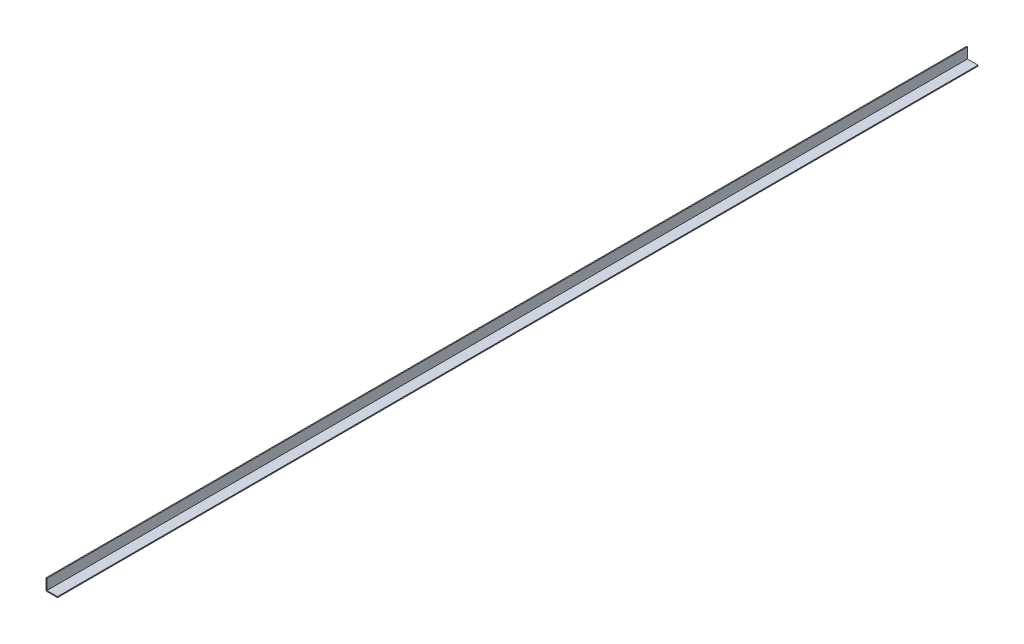
ISO-10303-21;
HEADER;
FILE_DESCRIPTION(('STEP AP214'),'2;1');
FILE_NAME('part.step','',(''),(''),'','','');
FILE_SCHEMA(('AUTOMOTIVE_DESIGN { 1 0 10303 214 1 1 1 1 }'));
ENDSEC;
DATA;
#1=APPLICATION_CONTEXT('core data for automotive mechanical design processes');
#2=APPLICATION_PROTOCOL_DEFINITION('international standard','automotive_design',2000,#1);
#3=PRODUCT_CONTEXT('',#1,'mechanical');
#4=PRODUCT('Part','Part','',(#3));
#5=PRODUCT_RELATED_PRODUCT_CATEGORY('part','',(#4));
#6=PRODUCT_DEFINITION_FORMATION('','',#4);
#7=PRODUCT_DEFINITION_CONTEXT('part definition',#1,'design');
#8=PRODUCT_DEFINITION('design','',#6,#7);
#9=PRODUCT_DEFINITION_SHAPE('','',#8);
#10=(LENGTH_UNIT() NAMED_UNIT(*) SI_UNIT(.MILLI.,.METRE.));
#11=(NAMED_UNIT(*) PLANE_ANGLE_UNIT() SI_UNIT($,.RADIAN.));
#12=(NAMED_UNIT(*) SI_UNIT($,.STERADIAN.) SOLID_ANGLE_UNIT());
#13=UNCERTAINTY_MEASURE_WITH_UNIT(LENGTH_MEASURE(1.E-05),#10,'distance_accuracy_value','');
#14=(GEOMETRIC_REPRESENTATION_CONTEXT(3) GLOBAL_UNCERTAINTY_ASSIGNED_CONTEXT((#13)) GLOBAL_UNIT_ASSIGNED_CONTEXT((#10,
#11,#12)) REPRESENTATION_CONTEXT('',''));
#15=CARTESIAN_POINT('',(0.,0.,0.));
#16=DIRECTION('',(0.,0.,1.));
#17=DIRECTION('',(1.,0.,0.));
#18=AXIS2_PLACEMENT_3D('',#15,#16,#17);
#19=CARTESIAN_POINT('',(6.35,76.2,-6100.));
#20=DIRECTION('',(0.,1.,0.));
#21=DIRECTION('',(0.,0.,1.));
#22=AXIS2_PLACEMENT_3D('',#19,#20,#21);
#23=PLANE('',#22);
#24=DIRECTION('',(-1.,0.,0.));
#25=VECTOR('',#24,1.);
#26=CARTESIAN_POINT('',(6.35,76.2,0.));
#27=LINE('',#26,#25);
#28=CARTESIAN_POINT('',(6.35,76.2,0.));
#29=VERTEX_POINT('',#28);
#30=CARTESIAN_POINT('',(0.,76.2,0.));
#31=VERTEX_POINT('',#30);
#32=EDGE_CURVE('E118',#29,#31,#27,.T.);
#33=ORIENTED_EDGE('',*,*,#32,.F.);
#34=DIRECTION('',(0.,0.,1.));
#35=VECTOR('',#34,1.);
#36=CARTESIAN_POINT('',(6.35,76.2,-6100.));
#37=LINE('',#36,#35);
#38=CARTESIAN_POINT('',(6.35,76.2,-6100.));
#39=VERTEX_POINT('',#38);
#40=EDGE_CURVE('E11',#39,#29,#37,.T.);
#41=ORIENTED_EDGE('',*,*,#40,.F.);
#42=DIRECTION('',(-1.,0.,0.));
#43=VECTOR('',#42,1.);
#44=CARTESIAN_POINT('',(6.35,76.2,-6100.));
#45=LINE('',#44,#43);
#46=CARTESIAN_POINT('',(0.,76.2,-6100.));
#47=VERTEX_POINT('',#46);
#48=EDGE_CURVE('E132',#39,#47,#45,.T.);
#49=ORIENTED_EDGE('',*,*,#48,.T.);
#50=DIRECTION('',(0.,0.,1.));
#51=VECTOR('',#50,1.);
#52=CARTESIAN_POINT('',(0.,76.2,-6100.));
#53=LINE('',#52,#51);
#54=EDGE_CURVE('E36',#47,#31,#53,.T.);
#55=ORIENTED_EDGE('',*,*,#54,.T.);
#56=EDGE_LOOP('',(#33,#41,#49,#55));
#57=FACE_BOUND('',#56,.T.);
#58=ADVANCED_FACE('F33',(#57),#23,.T.);
#59=CARTESIAN_POINT('',(6.35,6.35,-6100.));
#60=DIRECTION('',(1.,0.,0.));
#61=DIRECTION('',(0.,1.,0.));
#62=AXIS2_PLACEMENT_3D('',#59,#60,#61);
#63=PLANE('',#62);
#64=DIRECTION('',(0.,1.,0.));
#65=VECTOR('',#64,1.);
#66=CARTESIAN_POINT('',(6.35,6.35,0.));
#67=LINE('',#66,#65);
#68=CARTESIAN_POINT('',(6.35,6.35,0.));
#69=VERTEX_POINT('',#68);
#70=EDGE_CURVE('E130',#69,#29,#67,.T.);
#71=ORIENTED_EDGE('',*,*,#70,.F.);
#72=DIRECTION('',(0.,0.,1.));
#73=VECTOR('',#72,1.);
#74=CARTESIAN_POINT('',(6.35,6.35,-6100.));
#75=LINE('',#74,#73);
#76=CARTESIAN_POINT('',(6.35,6.35,-6100.));
#77=VERTEX_POINT('',#76);
#78=EDGE_CURVE('E42',#77,#69,#75,.T.);
#79=ORIENTED_EDGE('',*,*,#78,.F.);
#80=DIRECTION('',(0.,1.,0.));
#81=VECTOR('',#80,1.);
#82=CARTESIAN_POINT('',(6.35,6.35,-6100.));
#83=LINE('',#82,#81);
#84=EDGE_CURVE('E108',#77,#39,#83,.T.);
#85=ORIENTED_EDGE('',*,*,#84,.T.);
#86=ORIENTED_EDGE('',*,*,#40,.T.);
#87=EDGE_LOOP('',(#71,#79,#85,#86));
#88=FACE_BOUND('',#87,.T.);
#89=ADVANCED_FACE('F140',(#88),#63,.T.);
#90=CARTESIAN_POINT('',(76.2,6.35,-6100.));
#91=DIRECTION('',(0.,1.,0.));
#92=DIRECTION('',(-1.,0.,0.));
#93=AXIS2_PLACEMENT_3D('',#90,#91,#92);
#94=PLANE('',#93);
#95=DIRECTION('',(-1.,0.,0.));
#96=VECTOR('',#95,1.);
#97=CARTESIAN_POINT('',(76.2,6.35,0.));
#98=LINE('',#97,#96);
#99=CARTESIAN_POINT('',(76.2,6.35,0.));
#100=VERTEX_POINT('',#99);
#101=EDGE_CURVE('E95',#100,#69,#98,.T.);
#102=ORIENTED_EDGE('',*,*,#101,.F.);
#103=DIRECTION('',(0.,0.,1.));
#104=VECTOR('',#103,1.);
#105=CARTESIAN_POINT('',(76.2,6.35,-6100.));
#106=LINE('',#105,#104);
#107=CARTESIAN_POINT('',(76.2,6.35,-6100.));
#108=VERTEX_POINT('',#107);
#109=EDGE_CURVE('E90',#108,#100,#106,.T.);
#110=ORIENTED_EDGE('',*,*,#109,.F.);
#111=DIRECTION('',(-1.,0.,0.));
#112=VECTOR('',#111,1.);
#113=CARTESIAN_POINT('',(76.2,6.35,-6100.));
#114=LINE('',#113,#112);
#115=EDGE_CURVE('E93',#108,#77,#114,.T.);
#116=ORIENTED_EDGE('',*,*,#115,.T.);
#117=ORIENTED_EDGE('',*,*,#78,.T.);
#118=EDGE_LOOP('',(#102,#110,#116,#117));
#119=FACE_BOUND('',#118,.T.);
#120=ADVANCED_FACE('F92',(#119),#94,.T.);
#121=CARTESIAN_POINT('',(76.2,0.,-6100.));
#122=DIRECTION('',(1.,0.,0.));
#123=DIRECTION('',(0.,0.,-1.));
#124=AXIS2_PLACEMENT_3D('',#121,#122,#123);
#125=PLANE('',#124);
#126=DIRECTION('',(0.,1.,0.));
#127=VECTOR('',#126,1.);
#128=CARTESIAN_POINT('',(76.2,0.,0.));
#129=LINE('',#128,#127);
#130=CARTESIAN_POINT('',(76.2,0.,0.));
#131=VERTEX_POINT('',#130);
#132=EDGE_CURVE('E127',#131,#100,#129,.T.);
#133=ORIENTED_EDGE('',*,*,#132,.F.);
#134=DIRECTION('',(0.,0.,1.));
#135=VECTOR('',#134,1.);
#136=CARTESIAN_POINT('',(76.2,0.,-6100.));
#137=LINE('',#136,#135);
#138=CARTESIAN_POINT('',(76.2,0.,-6100.));
#139=VERTEX_POINT('',#138);
#140=EDGE_CURVE('E100',#139,#131,#137,.T.);
#141=ORIENTED_EDGE('',*,*,#140,.F.);
#142=DIRECTION('',(0.,1.,0.));
#143=VECTOR('',#142,1.);
#144=CARTESIAN_POINT('',(76.2,0.,-6100.));
#145=LINE('',#144,#143);
#146=EDGE_CURVE('E106',#139,#108,#145,.T.);
#147=ORIENTED_EDGE('',*,*,#146,.T.);
#148=ORIENTED_EDGE('',*,*,#109,.T.);
#149=EDGE_LOOP('',(#133,#141,#147,#148));
#150=FACE_BOUND('',#149,.T.);
#151=ADVANCED_FACE('F110',(#150),#125,.T.);
#152=CARTESIAN_POINT('',(0.,0.,-6100.));
#153=DIRECTION('',(0.,-1.,0.));
#154=DIRECTION('',(0.,0.,-1.));
#155=AXIS2_PLACEMENT_3D('',#152,#153,#154);
#156=PLANE('',#155);
#157=DIRECTION('',(1.,0.,0.));
#158=VECTOR('',#157,1.);
#159=CARTESIAN_POINT('',(0.,0.,0.));
#160=LINE('',#159,#158);
#161=CARTESIAN_POINT('',(0.,0.,0.));
#162=VERTEX_POINT('',#161);
#163=EDGE_CURVE('E124',#162,#131,#160,.T.);
#164=ORIENTED_EDGE('',*,*,#163,.F.);
#165=DIRECTION('',(0.,0.,1.));
#166=VECTOR('',#165,1.);
#167=CARTESIAN_POINT('',(0.,0.,-6100.));
#168=LINE('',#167,#166);
#169=CARTESIAN_POINT('',(0.,0.,-6100.));
#170=VERTEX_POINT('',#169);
#171=EDGE_CURVE('E135',#170,#162,#168,.T.);
#172=ORIENTED_EDGE('',*,*,#171,.F.);
#173=DIRECTION('',(1.,0.,0.));
#174=VECTOR('',#173,1.);
#175=CARTESIAN_POINT('',(0.,0.,-6100.));
#176=LINE('',#175,#174);
#177=EDGE_CURVE('E111',#170,#139,#176,.T.);
#178=ORIENTED_EDGE('',*,*,#177,.T.);
#179=ORIENTED_EDGE('',*,*,#140,.T.);
#180=EDGE_LOOP('',(#164,#172,#178,#179));
#181=FACE_BOUND('',#180,.T.);
#182=ADVANCED_FACE('F153',(#181),#156,.T.);
#183=CARTESIAN_POINT('',(0.,76.2,-6100.));
#184=DIRECTION('',(-1.,0.,0.));
#185=DIRECTION('',(0.,-1.,0.));
#186=AXIS2_PLACEMENT_3D('',#183,#184,#185);
#187=PLANE('',#186);
#188=DIRECTION('',(0.,-1.,0.));
#189=VECTOR('',#188,1.);
#190=CARTESIAN_POINT('',(0.,76.2,0.));
#191=LINE('',#190,#189);
#192=EDGE_CURVE('E121',#31,#162,#191,.T.);
#193=ORIENTED_EDGE('',*,*,#192,.F.);
#194=ORIENTED_EDGE('',*,*,#54,.F.);
#195=DIRECTION('',(0.,-1.,0.));
#196=VECTOR('',#195,1.);
#197=CARTESIAN_POINT('',(0.,76.2,-6100.));
#198=LINE('',#197,#196);
#199=EDGE_CURVE('E113',#47,#170,#198,.T.);
#200=ORIENTED_EDGE('',*,*,#199,.T.);
#201=ORIENTED_EDGE('',*,*,#171,.T.);
#202=EDGE_LOOP('',(#193,#194,#200,#201));
#203=FACE_BOUND('',#202,.T.);
#204=ADVANCED_FACE('F137',(#203),#187,.T.);
#205=CARTESIAN_POINT('',(0.,0.,-6100.));
#206=DIRECTION('',(0.,0.,1.));
#207=DIRECTION('',(1.,0.,0.));
#208=AXIS2_PLACEMENT_3D('',#205,#206,#207);
#209=PLANE('',#208);
#210=ORIENTED_EDGE('',*,*,#48,.F.);
#211=ORIENTED_EDGE('',*,*,#84,.F.);
#212=ORIENTED_EDGE('',*,*,#115,.F.);
#213=ORIENTED_EDGE('',*,*,#146,.F.);
#214=ORIENTED_EDGE('',*,*,#177,.F.);
#215=ORIENTED_EDGE('',*,*,#199,.F.);
#216=EDGE_LOOP('',(#210,#211,#212,#213,#214,#215));
#217=FACE_BOUND('',#216,.T.);
#218=ADVANCED_FACE('F104',(#217),#209,.F.);
#219=CARTESIAN_POINT('',(0.,0.,0.));
#220=DIRECTION('',(0.,0.,1.));
#221=DIRECTION('',(1.,0.,0.));
#222=AXIS2_PLACEMENT_3D('',#219,#220,#221);
#223=PLANE('',#222);
#224=ORIENTED_EDGE('',*,*,#32,.T.);
#225=ORIENTED_EDGE('',*,*,#192,.T.);
#226=ORIENTED_EDGE('',*,*,#163,.T.);
#227=ORIENTED_EDGE('',*,*,#132,.T.);
#228=ORIENTED_EDGE('',*,*,#101,.T.);
#229=ORIENTED_EDGE('',*,*,#70,.T.);
#230=EDGE_LOOP('',(#224,#225,#226,#227,#228,#229));
#231=FACE_BOUND('',#230,.T.);
#232=ADVANCED_FACE('F139',(#231),#223,.T.);
#233=CLOSED_SHELL('',(#58,#89,#120,#151,#182,#204,#218,#232));
#234=MANIFOLD_SOLID_BREP('B2',#233);
#235=ADVANCED_BREP_SHAPE_REPRESENTATION('',(#18,#234),#14);
#236=SHAPE_DEFINITION_REPRESENTATION(#9,#235);
ENDSEC;
END-ISO-10303-21;
